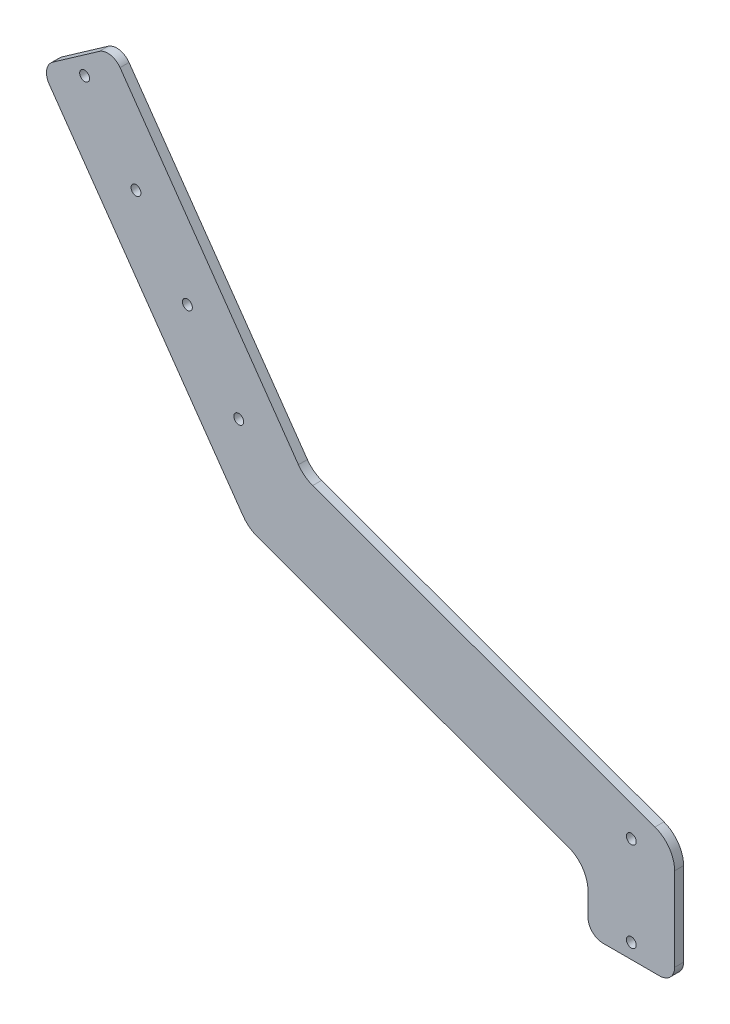
ISO-10303-21;
HEADER;
FILE_DESCRIPTION(('STEP AP214'),'2;1');
FILE_NAME('part.step','',(''),(''),'','','');
FILE_SCHEMA(('AUTOMOTIVE_DESIGN { 1 0 10303 214 1 1 1 1 }'));
ENDSEC;
DATA;
#1=APPLICATION_CONTEXT('core data for automotive mechanical design processes');
#2=APPLICATION_PROTOCOL_DEFINITION('international standard','automotive_design',2000,#1);
#3=PRODUCT_CONTEXT('',#1,'mechanical');
#4=PRODUCT('Part','Part','',(#3));
#5=PRODUCT_RELATED_PRODUCT_CATEGORY('part','',(#4));
#6=PRODUCT_DEFINITION_FORMATION('','',#4);
#7=PRODUCT_DEFINITION_CONTEXT('part definition',#1,'design');
#8=PRODUCT_DEFINITION('design','',#6,#7);
#9=PRODUCT_DEFINITION_SHAPE('','',#8);
#10=(LENGTH_UNIT() NAMED_UNIT(*) SI_UNIT(.MILLI.,.METRE.));
#11=(NAMED_UNIT(*) PLANE_ANGLE_UNIT() SI_UNIT($,.RADIAN.));
#12=(NAMED_UNIT(*) SI_UNIT($,.STERADIAN.) SOLID_ANGLE_UNIT());
#13=UNCERTAINTY_MEASURE_WITH_UNIT(LENGTH_MEASURE(1.E-05),#10,'distance_accuracy_value','');
#14=(GEOMETRIC_REPRESENTATION_CONTEXT(3) GLOBAL_UNCERTAINTY_ASSIGNED_CONTEXT((#13)) GLOBAL_UNIT_ASSIGNED_CONTEXT((#10,
#11,#12)) REPRESENTATION_CONTEXT('',''));
#15=CARTESIAN_POINT('',(0.,0.,0.));
#16=DIRECTION('',(0.,0.,1.));
#17=DIRECTION('',(1.,0.,0.));
#18=AXIS2_PLACEMENT_3D('',#15,#16,#17);
#19=CARTESIAN_POINT('',(0.,0.,3.));
#20=DIRECTION('',(0.,0.,1.));
#21=DIRECTION('',(1.,0.,0.));
#22=AXIS2_PLACEMENT_3D('',#19,#20,#21);
#23=PLANE('',#22);
#24=CARTESIAN_POINT('',(-148.638066054387,110.585525979013,3.));
#25=DIRECTION('',(0.,0.,1.));
#26=DIRECTION('',(1.,0.,0.));
#27=AXIS2_PLACEMENT_3D('',#24,#25,#26);
#28=CIRCLE('',#27,1.65000000000002);
#29=CARTESIAN_POINT('',(-146.988066054387,110.585525979013,3.));
#30=VERTEX_POINT('',#29);
#31=EDGE_CURVE('E324',#30,#30,#28,.T.);
#32=ORIENTED_EDGE('',*,*,#31,.F.);
#33=EDGE_LOOP('',(#32));
#34=FACE_BOUND('',#33,.T.);
#35=CARTESIAN_POINT('',(-183.05265223545,159.734648636353,3.));
#36=DIRECTION('',(0.,0.,1.));
#37=DIRECTION('',(1.,0.,0.));
#38=AXIS2_PLACEMENT_3D('',#35,#36,#37);
#39=CIRCLE('',#38,1.65000000000002);
#40=CARTESIAN_POINT('',(-181.40265223545,159.734648636353,3.));
#41=VERTEX_POINT('',#40);
#42=EDGE_CURVE('E312',#41,#41,#39,.T.);
#43=ORIENTED_EDGE('',*,*,#42,.F.);
#44=EDGE_LOOP('',(#43));
#45=FACE_BOUND('',#44,.T.);
#46=CARTESIAN_POINT('',(0.,0.,3.));
#47=DIRECTION('',(0.,0.,1.));
#48=DIRECTION('',(1.,0.,0.));
#49=AXIS2_PLACEMENT_3D('',#46,#47,#48);
#50=CIRCLE('',#49,1.65);
#51=CARTESIAN_POINT('',(1.65,0.,3.));
#52=VERTEX_POINT('',#51);
#53=EDGE_CURVE('E182',#52,#52,#50,.T.);
#54=ORIENTED_EDGE('',*,*,#53,.F.);
#55=EDGE_LOOP('',(#54));
#56=FACE_BOUND('',#55,.T.);
#57=DIRECTION('',(1.,0.,0.));
#58=VECTOR('',#57,1.);
#59=CARTESIAN_POINT('',(-14.5,-5.,3.));
#60=LINE('',#59,#58);
#61=CARTESIAN_POINT('',(-9.5,-5.,3.));
#62=VERTEX_POINT('',#61);
#63=CARTESIAN_POINT('',(9.49999999999999,-5.,3.));
#64=VERTEX_POINT('',#63);
#65=EDGE_CURVE('E303',#62,#64,#60,.T.);
#66=ORIENTED_EDGE('',*,*,#65,.T.);
#67=CARTESIAN_POINT('',(9.5,0.,3.));
#68=DIRECTION('',(0.,0.,1.));
#69=DIRECTION('',(1.,0.,0.));
#70=AXIS2_PLACEMENT_3D('',#67,#68,#69);
#71=CIRCLE('',#70,5.);
#72=CARTESIAN_POINT('',(14.5,0.,3.));
#73=VERTEX_POINT('',#72);
#74=EDGE_CURVE('E258',#64,#73,#71,.T.);
#75=ORIENTED_EDGE('',*,*,#74,.T.);
#76=DIRECTION('',(0.,1.,0.));
#77=VECTOR('',#76,1.);
#78=CARTESIAN_POINT('',(14.5,-5.,3.));
#79=LINE('',#78,#77);
#80=CARTESIAN_POINT('',(14.5,27.9979246179029,3.));
#81=VERTEX_POINT('',#80);
#82=EDGE_CURVE('E301',#73,#81,#79,.T.);
#83=ORIENTED_EDGE('',*,*,#82,.T.);
#84=CARTESIAN_POINT('',(4.5,27.9979246179029,3.));
#85=DIRECTION('',(0.,0.,1.));
#86=DIRECTION('',(1.,0.,0.));
#87=AXIS2_PLACEMENT_3D('',#84,#85,#86);
#88=CIRCLE('',#87,10.);
#89=CARTESIAN_POINT('',(7.92020143325664,37.394850825762,3.));
#90=VERTEX_POINT('',#89);
#91=EDGE_CURVE('E229',#81,#90,#88,.T.);
#92=ORIENTED_EDGE('',*,*,#91,.T.);
#93=DIRECTION('',(-0.939692620785909,0.342020143325666,0.));
#94=VECTOR('',#93,1.);
#95=CARTESIAN_POINT('',(-109.652000503099,80.1876327077301,3.));
#96=LINE('',#95,#94);
#97=CARTESIAN_POINT('',(-106.689161050576,79.1092473381022,3.));
#98=VERTEX_POINT('',#97);
#99=EDGE_CURVE('E281',#90,#98,#96,.T.);
#100=ORIENTED_EDGE('',*,*,#99,.T.);
#101=CARTESIAN_POINT('',(-103.268959617319,88.5061735459612,3.));
#102=DIRECTION('',(0.,0.,1.));
#103=DIRECTION('',(1.,0.,0.));
#104=AXIS2_PLACEMENT_3D('',#101,#102,#103);
#105=CIRCLE('',#104,10.);
#106=CARTESIAN_POINT('',(-111.460480060209,82.7704091824507,3.));
#107=VERTEX_POINT('',#106);
#108=EDGE_CURVE('E236',#98,#107,#105,.F.);
#109=ORIENTED_EDGE('',*,*,#108,.T.);
#110=DIRECTION('',(-0.57357643635105,0.819152044288989,0.));
#111=VECTOR('',#110,1.);
#112=CARTESIAN_POINT('',(-174.042829775015,172.147267184888,3.));
#113=LINE('',#112,#111);
#114=CARTESIAN_POINT('',(-171.17494759326,168.051506963443,3.));
#115=VERTEX_POINT('',#114);
#116=EDGE_CURVE('E270',#107,#115,#113,.T.);
#117=ORIENTED_EDGE('',*,*,#116,.T.);
#118=CARTESIAN_POINT('',(-175.270707814705,165.183624781688,3.));
#119=DIRECTION('',(0.,0.,1.));
#120=DIRECTION('',(1.,0.,0.));
#121=AXIS2_PLACEMENT_3D('',#118,#119,#120);
#122=CIRCLE('',#121,5.);
#123=CARTESIAN_POINT('',(-178.13858999646,169.279385003133,3.));
#124=VERTEX_POINT('',#123);
#125=EDGE_CURVE('E254',#115,#124,#122,.T.);
#126=ORIENTED_EDGE('',*,*,#125,.T.);
#127=DIRECTION('',(-0.819152044288989,-0.57357643635105,0.));
#128=VECTOR('',#127,1.);
#129=CARTESIAN_POINT('',(-174.042829775015,172.147267184888,3.));
#130=LINE('',#129,#128);
#131=CARTESIAN_POINT('',(-193.702478837951,158.381432712463,3.));
#132=VERTEX_POINT('',#131);
#133=EDGE_CURVE('E280',#124,#132,#130,.T.);
#134=ORIENTED_EDGE('',*,*,#133,.T.);
#135=CARTESIAN_POINT('',(-190.834596656196,154.285672491018,3.));
#136=DIRECTION('',(0.,0.,1.));
#137=DIRECTION('',(1.,0.,0.));
#138=AXIS2_PLACEMENT_3D('',#135,#136,#137);
#139=CIRCLE('',#138,5.);
#140=CARTESIAN_POINT('',(-194.930356877641,151.417790309263,3.));
#141=VERTEX_POINT('',#140);
#142=EDGE_CURVE('E64',#132,#141,#139,.T.);
#143=ORIENTED_EDGE('',*,*,#142,.T.);
#144=DIRECTION('',(0.57357643635105,-0.819152044288989,0.));
#145=VECTOR('',#144,1.);
#146=CARTESIAN_POINT('',(-197.798239059396,155.513550530708,3.));
#147=LINE('',#146,#145);
#148=CARTESIAN_POINT('',(-129.971298628971,58.6466407515806,3.));
#149=VERTEX_POINT('',#148);
#150=EDGE_CURVE('E294',#141,#149,#147,.T.);
#151=ORIENTED_EDGE('',*,*,#150,.T.);
#152=CARTESIAN_POINT('',(-121.779778186081,64.3824051150911,3.));
#153=DIRECTION('',(0.,0.,1.));
#154=DIRECTION('',(1.,0.,0.));
#155=AXIS2_PLACEMENT_3D('',#152,#153,#154);
#156=CIRCLE('',#155,10.);
#157=CARTESIAN_POINT('',(-125.199979619337,54.985478907232,3.));
#158=VERTEX_POINT('',#157);
#159=EDGE_CURVE('E227',#149,#158,#156,.T.);
#160=ORIENTED_EDGE('',*,*,#159,.T.);
#161=DIRECTION('',(0.93969262078591,-0.342020143325665,0.));
#162=VECTOR('',#161,1.);
#163=CARTESIAN_POINT('',(-128.16281907186,56.06386427686,3.));
#164=LINE('',#163,#162);
#165=CARTESIAN_POINT('',(-21.0797985667433,17.0888322176803,3.));
#166=VERTEX_POINT('',#165);
#167=EDGE_CURVE('E174',#158,#166,#164,.T.);
#168=ORIENTED_EDGE('',*,*,#167,.T.);
#169=CARTESIAN_POINT('',(-24.5,7.69190600982124,3.));
#170=DIRECTION('',(0.,0.,1.));
#171=DIRECTION('',(1.,0.,0.));
#172=AXIS2_PLACEMENT_3D('',#169,#170,#171);
#173=CIRCLE('',#172,10.);
#174=CARTESIAN_POINT('',(-14.5,7.69190600982124,3.));
#175=VERTEX_POINT('',#174);
#176=EDGE_CURVE('E167',#166,#175,#173,.F.);
#177=ORIENTED_EDGE('',*,*,#176,.T.);
#178=DIRECTION('',(0.,-1.,0.));
#179=VECTOR('',#178,1.);
#180=CARTESIAN_POINT('',(-14.5,14.6939813919184,3.));
#181=LINE('',#180,#179);
#182=CARTESIAN_POINT('',(-14.5,0.,3.));
#183=VERTEX_POINT('',#182);
#184=EDGE_CURVE('E172',#175,#183,#181,.T.);
#185=ORIENTED_EDGE('',*,*,#184,.T.);
#186=CARTESIAN_POINT('',(-9.5,0.,3.));
#187=DIRECTION('',(0.,0.,1.));
#188=DIRECTION('',(1.,0.,0.));
#189=AXIS2_PLACEMENT_3D('',#186,#187,#188);
#190=CIRCLE('',#189,5.);
#191=EDGE_CURVE('E256',#183,#62,#190,.T.);
#192=ORIENTED_EDGE('',*,*,#191,.T.);
#193=EDGE_LOOP('',(#66,#75,#83,#92,#100,#109,#117,#126,#134,#143,#151,#160,#168,#177,#185,#192));
#194=FACE_BOUND('',#193,.T.);
#195=CARTESIAN_POINT('',(0.,30.,3.));
#196=DIRECTION('',(0.,0.,1.));
#197=DIRECTION('',(1.,0.,0.));
#198=AXIS2_PLACEMENT_3D('',#195,#196,#197);
#199=CIRCLE('',#198,1.65);
#200=CARTESIAN_POINT('',(1.65,30.,3.));
#201=VERTEX_POINT('',#200);
#202=EDGE_CURVE('E307',#201,#201,#199,.T.);
#203=ORIENTED_EDGE('',*,*,#202,.F.);
#204=EDGE_LOOP('',(#203));
#205=FACE_BOUND('',#204,.T.);
#206=CARTESIAN_POINT('',(-165.845359144919,135.160087307683,3.));
#207=DIRECTION('',(0.,0.,1.));
#208=DIRECTION('',(1.,0.,0.));
#209=AXIS2_PLACEMENT_3D('',#206,#207,#208);
#210=CIRCLE('',#209,1.65000000000002);
#211=CARTESIAN_POINT('',(-164.195359144919,135.160087307683,3.));
#212=VERTEX_POINT('',#211);
#213=EDGE_CURVE('E318',#212,#212,#210,.T.);
#214=ORIENTED_EDGE('',*,*,#213,.F.);
#215=EDGE_LOOP('',(#214));
#216=FACE_BOUND('',#215,.T.);
#217=CARTESIAN_POINT('',(-131.430772963856,86.0109646503438,3.));
#218=DIRECTION('',(0.,0.,1.));
#219=DIRECTION('',(1.,0.,0.));
#220=AXIS2_PLACEMENT_3D('',#217,#218,#219);
#221=CIRCLE('',#220,1.65000000000002);
#222=CARTESIAN_POINT('',(-129.780772963856,86.0109646503438,3.));
#223=VERTEX_POINT('',#222);
#224=EDGE_CURVE('E330',#223,#223,#221,.T.);
#225=ORIENTED_EDGE('',*,*,#224,.F.);
#226=EDGE_LOOP('',(#225));
#227=FACE_BOUND('',#226,.T.);
#228=ADVANCED_FACE('F41',(#34,#45,#56,#194,#205,#216,#227),#23,.T.);
#229=CARTESIAN_POINT('',(0.,0.,0.));
#230=DIRECTION('',(0.,0.,1.));
#231=DIRECTION('',(1.,0.,0.));
#232=AXIS2_PLACEMENT_3D('',#229,#230,#231);
#233=PLANE('',#232);
#234=DIRECTION('',(0.,1.,0.));
#235=VECTOR('',#234,1.);
#236=CARTESIAN_POINT('',(14.5,-5.,0.));
#237=LINE('',#236,#235);
#238=CARTESIAN_POINT('',(14.5,0.,0.));
#239=VERTEX_POINT('',#238);
#240=CARTESIAN_POINT('',(14.5,27.9979246179029,0.));
#241=VERTEX_POINT('',#240);
#242=EDGE_CURVE('E185',#239,#241,#237,.T.);
#243=ORIENTED_EDGE('',*,*,#242,.F.);
#244=CARTESIAN_POINT('',(9.5,0.,0.));
#245=DIRECTION('',(0.,0.,1.));
#246=DIRECTION('',(1.,0.,0.));
#247=AXIS2_PLACEMENT_3D('',#244,#245,#246);
#248=CIRCLE('',#247,5.);
#249=CARTESIAN_POINT('',(9.49999999999999,-5.,0.));
#250=VERTEX_POINT('',#249);
#251=EDGE_CURVE('E246',#239,#250,#248,.F.);
#252=ORIENTED_EDGE('',*,*,#251,.T.);
#253=DIRECTION('',(1.,0.,0.));
#254=VECTOR('',#253,1.);
#255=CARTESIAN_POINT('',(-14.5,-5.,0.));
#256=LINE('',#255,#254);
#257=CARTESIAN_POINT('',(-9.5,-5.,0.));
#258=VERTEX_POINT('',#257);
#259=EDGE_CURVE('E181',#258,#250,#256,.T.);
#260=ORIENTED_EDGE('',*,*,#259,.F.);
#261=CARTESIAN_POINT('',(-9.5,0.,0.));
#262=DIRECTION('',(0.,0.,1.));
#263=DIRECTION('',(1.,0.,0.));
#264=AXIS2_PLACEMENT_3D('',#261,#262,#263);
#265=CIRCLE('',#264,5.);
#266=CARTESIAN_POINT('',(-14.5,0.,0.));
#267=VERTEX_POINT('',#266);
#268=EDGE_CURVE('E180',#258,#267,#265,.F.);
#269=ORIENTED_EDGE('',*,*,#268,.T.);
#270=DIRECTION('',(0.,-1.,0.));
#271=VECTOR('',#270,1.);
#272=CARTESIAN_POINT('',(-14.5,14.6939813919184,0.));
#273=LINE('',#272,#271);
#274=CARTESIAN_POINT('',(-14.5,7.69190600982124,0.));
#275=VERTEX_POINT('',#274);
#276=EDGE_CURVE('E171',#275,#267,#273,.T.);
#277=ORIENTED_EDGE('',*,*,#276,.F.);
#278=CARTESIAN_POINT('',(-24.5,7.69190600982124,0.));
#279=DIRECTION('',(0.,0.,1.));
#280=DIRECTION('',(1.,0.,0.));
#281=AXIS2_PLACEMENT_3D('',#278,#279,#280);
#282=CIRCLE('',#281,10.);
#283=CARTESIAN_POINT('',(-21.0797985667433,17.0888322176803,0.));
#284=VERTEX_POINT('',#283);
#285=EDGE_CURVE('E157',#275,#284,#282,.T.);
#286=ORIENTED_EDGE('',*,*,#285,.T.);
#287=DIRECTION('',(0.93969262078591,-0.342020143325665,0.));
#288=VECTOR('',#287,1.);
#289=CARTESIAN_POINT('',(-128.16281907186,56.06386427686,0.));
#290=LINE('',#289,#288);
#291=CARTESIAN_POINT('',(-125.199979619337,54.985478907232,0.));
#292=VERTEX_POINT('',#291);
#293=EDGE_CURVE('E205',#292,#284,#290,.T.);
#294=ORIENTED_EDGE('',*,*,#293,.F.);
#295=CARTESIAN_POINT('',(-121.779778186081,64.3824051150911,0.));
#296=DIRECTION('',(0.,0.,1.));
#297=DIRECTION('',(1.,0.,0.));
#298=AXIS2_PLACEMENT_3D('',#295,#296,#297);
#299=CIRCLE('',#298,10.);
#300=CARTESIAN_POINT('',(-129.971298628971,58.6466407515806,0.));
#301=VERTEX_POINT('',#300);
#302=EDGE_CURVE('E218',#292,#301,#299,.F.);
#303=ORIENTED_EDGE('',*,*,#302,.T.);
#304=DIRECTION('',(0.57357643635105,-0.819152044288989,0.));
#305=VECTOR('',#304,1.);
#306=CARTESIAN_POINT('',(-197.798239059396,155.513550530708,0.));
#307=LINE('',#306,#305);
#308=CARTESIAN_POINT('',(-194.930356877641,151.417790309263,0.));
#309=VERTEX_POINT('',#308);
#310=EDGE_CURVE('E203',#309,#301,#307,.T.);
#311=ORIENTED_EDGE('',*,*,#310,.F.);
#312=CARTESIAN_POINT('',(-190.834596656196,154.285672491018,0.));
#313=DIRECTION('',(0.,0.,1.));
#314=DIRECTION('',(1.,0.,0.));
#315=AXIS2_PLACEMENT_3D('',#312,#313,#314);
#316=CIRCLE('',#315,5.);
#317=CARTESIAN_POINT('',(-193.702478837951,158.381432712463,0.));
#318=VERTEX_POINT('',#317);
#319=EDGE_CURVE('E241',#309,#318,#316,.F.);
#320=ORIENTED_EDGE('',*,*,#319,.T.);
#321=DIRECTION('',(-0.819152044288989,-0.57357643635105,0.));
#322=VECTOR('',#321,1.);
#323=CARTESIAN_POINT('',(-174.042829775015,172.147267184888,0.));
#324=LINE('',#323,#322);
#325=CARTESIAN_POINT('',(-178.13858999646,169.279385003133,0.));
#326=VERTEX_POINT('',#325);
#327=EDGE_CURVE('E200',#326,#318,#324,.T.);
#328=ORIENTED_EDGE('',*,*,#327,.F.);
#329=CARTESIAN_POINT('',(-175.270707814705,165.183624781688,0.));
#330=DIRECTION('',(0.,0.,1.));
#331=DIRECTION('',(1.,0.,0.));
#332=AXIS2_PLACEMENT_3D('',#329,#330,#331);
#333=CIRCLE('',#332,5.);
#334=CARTESIAN_POINT('',(-171.17494759326,168.051506963443,0.));
#335=VERTEX_POINT('',#334);
#336=EDGE_CURVE('E243',#326,#335,#333,.F.);
#337=ORIENTED_EDGE('',*,*,#336,.T.);
#338=DIRECTION('',(-0.57357643635105,0.819152044288989,0.));
#339=VECTOR('',#338,1.);
#340=CARTESIAN_POINT('',(-174.042829775015,172.147267184888,0.));
#341=LINE('',#340,#339);
#342=CARTESIAN_POINT('',(-111.460480060209,82.7704091824507,0.));
#343=VERTEX_POINT('',#342);
#344=EDGE_CURVE('E197',#343,#335,#341,.T.);
#345=ORIENTED_EDGE('',*,*,#344,.F.);
#346=CARTESIAN_POINT('',(-103.268959617319,88.5061735459612,0.));
#347=DIRECTION('',(0.,0.,1.));
#348=DIRECTION('',(1.,0.,0.));
#349=AXIS2_PLACEMENT_3D('',#346,#347,#348);
#350=CIRCLE('',#349,10.);
#351=CARTESIAN_POINT('',(-106.689161050576,79.1092473381022,0.));
#352=VERTEX_POINT('',#351);
#353=EDGE_CURVE('E234',#343,#352,#350,.T.);
#354=ORIENTED_EDGE('',*,*,#353,.T.);
#355=DIRECTION('',(-0.939692620785909,0.342020143325666,0.));
#356=VECTOR('',#355,1.);
#357=CARTESIAN_POINT('',(-109.652000503099,80.1876327077301,0.));
#358=LINE('',#357,#356);
#359=CARTESIAN_POINT('',(7.92020143325664,37.394850825762,0.));
#360=VERTEX_POINT('',#359);
#361=EDGE_CURVE('E194',#360,#352,#358,.T.);
#362=ORIENTED_EDGE('',*,*,#361,.F.);
#363=CARTESIAN_POINT('',(4.5,27.9979246179029,0.));
#364=DIRECTION('',(0.,0.,1.));
#365=DIRECTION('',(1.,0.,0.));
#366=AXIS2_PLACEMENT_3D('',#363,#364,#365);
#367=CIRCLE('',#366,10.);
#368=EDGE_CURVE('E221',#360,#241,#367,.F.);
#369=ORIENTED_EDGE('',*,*,#368,.T.);
#370=EDGE_LOOP('',(#243,#252,#260,#269,#277,#286,#294,#303,#311,#320,#328,#337,#345,#354,#362,#369));
#371=FACE_BOUND('',#370,.T.);
#372=CARTESIAN_POINT('',(0.,0.,0.));
#373=DIRECTION('',(0.,0.,1.));
#374=DIRECTION('',(1.,0.,0.));
#375=AXIS2_PLACEMENT_3D('',#372,#373,#374);
#376=CIRCLE('',#375,1.65);
#377=CARTESIAN_POINT('',(1.65,0.,0.));
#378=VERTEX_POINT('',#377);
#379=EDGE_CURVE('E188',#378,#378,#376,.T.);
#380=ORIENTED_EDGE('',*,*,#379,.T.);
#381=EDGE_LOOP('',(#380));
#382=FACE_BOUND('',#381,.T.);
#383=CARTESIAN_POINT('',(0.,30.,0.));
#384=DIRECTION('',(0.,0.,1.));
#385=DIRECTION('',(1.,0.,0.));
#386=AXIS2_PLACEMENT_3D('',#383,#384,#385);
#387=CIRCLE('',#386,1.65);
#388=CARTESIAN_POINT('',(1.65,30.,0.));
#389=VERTEX_POINT('',#388);
#390=EDGE_CURVE('E309',#389,#389,#387,.T.);
#391=ORIENTED_EDGE('',*,*,#390,.T.);
#392=EDGE_LOOP('',(#391));
#393=FACE_BOUND('',#392,.T.);
#394=CARTESIAN_POINT('',(-183.05265223545,159.734648636353,0.));
#395=DIRECTION('',(0.,0.,1.));
#396=DIRECTION('',(1.,0.,0.));
#397=AXIS2_PLACEMENT_3D('',#394,#395,#396);
#398=CIRCLE('',#397,1.65000000000002);
#399=CARTESIAN_POINT('',(-181.40265223545,159.734648636353,0.));
#400=VERTEX_POINT('',#399);
#401=EDGE_CURVE('E315',#400,#400,#398,.T.);
#402=ORIENTED_EDGE('',*,*,#401,.T.);
#403=EDGE_LOOP('',(#402));
#404=FACE_BOUND('',#403,.T.);
#405=CARTESIAN_POINT('',(-165.845359144919,135.160087307683,0.));
#406=DIRECTION('',(0.,0.,1.));
#407=DIRECTION('',(1.,0.,0.));
#408=AXIS2_PLACEMENT_3D('',#405,#406,#407);
#409=CIRCLE('',#408,1.65000000000002);
#410=CARTESIAN_POINT('',(-164.195359144919,135.160087307683,0.));
#411=VERTEX_POINT('',#410);
#412=EDGE_CURVE('E321',#411,#411,#409,.T.);
#413=ORIENTED_EDGE('',*,*,#412,.T.);
#414=EDGE_LOOP('',(#413));
#415=FACE_BOUND('',#414,.T.);
#416=CARTESIAN_POINT('',(-148.638066054387,110.585525979013,0.));
#417=DIRECTION('',(0.,0.,1.));
#418=DIRECTION('',(1.,0.,0.));
#419=AXIS2_PLACEMENT_3D('',#416,#417,#418);
#420=CIRCLE('',#419,1.65000000000002);
#421=CARTESIAN_POINT('',(-146.988066054387,110.585525979013,0.));
#422=VERTEX_POINT('',#421);
#423=EDGE_CURVE('E327',#422,#422,#420,.T.);
#424=ORIENTED_EDGE('',*,*,#423,.T.);
#425=EDGE_LOOP('',(#424));
#426=FACE_BOUND('',#425,.T.);
#427=CARTESIAN_POINT('',(-131.430772963856,86.0109646503438,0.));
#428=DIRECTION('',(0.,0.,1.));
#429=DIRECTION('',(1.,0.,0.));
#430=AXIS2_PLACEMENT_3D('',#427,#428,#429);
#431=CIRCLE('',#430,1.65000000000002);
#432=CARTESIAN_POINT('',(-129.780772963856,86.0109646503438,0.));
#433=VERTEX_POINT('',#432);
#434=EDGE_CURVE('E333',#433,#433,#431,.T.);
#435=ORIENTED_EDGE('',*,*,#434,.T.);
#436=EDGE_LOOP('',(#435));
#437=FACE_BOUND('',#436,.T.);
#438=ADVANCED_FACE('F177',(#371,#382,#393,#404,#415,#426,#437),#233,.F.);
#439=CARTESIAN_POINT('',(-14.5,14.6939813919184,3.));
#440=DIRECTION('',(1.,0.,0.));
#441=DIRECTION('',(0.,1.,0.));
#442=AXIS2_PLACEMENT_3D('',#439,#440,#441);
#443=PLANE('',#442);
#444=ORIENTED_EDGE('',*,*,#276,.T.);
#445=DIRECTION('',(0.,0.,-1.));
#446=VECTOR('',#445,1.);
#447=CARTESIAN_POINT('',(-14.5,0.,3.));
#448=LINE('',#447,#446);
#449=EDGE_CURVE('E56',#267,#183,#448,.F.);
#450=ORIENTED_EDGE('',*,*,#449,.T.);
#451=ORIENTED_EDGE('',*,*,#184,.F.);
#452=DIRECTION('',(0.,0.,-1.));
#453=VECTOR('',#452,1.);
#454=CARTESIAN_POINT('',(-14.5,7.69190600982124,0.));
#455=LINE('',#454,#453);
#456=EDGE_CURVE('E161',#175,#275,#455,.T.);
#457=ORIENTED_EDGE('',*,*,#456,.T.);
#458=EDGE_LOOP('',(#444,#450,#451,#457));
#459=FACE_BOUND('',#458,.T.);
#460=ADVANCED_FACE('F170',(#459),#443,.F.);
#461=CARTESIAN_POINT('',(-14.5,-5.,3.));
#462=DIRECTION('',(0.,1.,0.));
#463=DIRECTION('',(0.,0.,1.));
#464=AXIS2_PLACEMENT_3D('',#461,#462,#463);
#465=PLANE('',#464);
#466=ORIENTED_EDGE('',*,*,#259,.T.);
#467=DIRECTION('',(0.,0.,-1.));
#468=VECTOR('',#467,1.);
#469=CARTESIAN_POINT('',(9.5,-5.,3.));
#470=LINE('',#469,#468);
#471=EDGE_CURVE('E251',#250,#64,#470,.F.);
#472=ORIENTED_EDGE('',*,*,#471,.T.);
#473=ORIENTED_EDGE('',*,*,#65,.F.);
#474=DIRECTION('',(0.,0.,-1.));
#475=VECTOR('',#474,1.);
#476=CARTESIAN_POINT('',(-9.5,-5.,3.));
#477=LINE('',#476,#475);
#478=EDGE_CURVE('E248',#62,#258,#477,.T.);
#479=ORIENTED_EDGE('',*,*,#478,.T.);
#480=EDGE_LOOP('',(#466,#472,#473,#479));
#481=FACE_BOUND('',#480,.T.);
#482=ADVANCED_FACE('F373',(#481),#465,.F.);
#483=CARTESIAN_POINT('',(14.5,-5.,3.));
#484=DIRECTION('',(-1.,0.,0.));
#485=DIRECTION('',(0.,-1.,0.));
#486=AXIS2_PLACEMENT_3D('',#483,#484,#485);
#487=PLANE('',#486);
#488=ORIENTED_EDGE('',*,*,#82,.F.);
#489=DIRECTION('',(0.,0.,-1.));
#490=VECTOR('',#489,1.);
#491=CARTESIAN_POINT('',(14.5,0.,3.));
#492=LINE('',#491,#490);
#493=EDGE_CURVE('E238',#73,#239,#492,.T.);
#494=ORIENTED_EDGE('',*,*,#493,.T.);
#495=ORIENTED_EDGE('',*,*,#242,.T.);
#496=DIRECTION('',(0.,0.,-1.));
#497=VECTOR('',#496,1.);
#498=CARTESIAN_POINT('',(14.5,27.9979246179029,3.));
#499=LINE('',#498,#497);
#500=EDGE_CURVE('E224',#241,#81,#499,.F.);
#501=ORIENTED_EDGE('',*,*,#500,.T.);
#502=EDGE_LOOP('',(#488,#494,#495,#501));
#503=FACE_BOUND('',#502,.T.);
#504=ADVANCED_FACE('F369',(#503),#487,.F.);
#505=CARTESIAN_POINT('',(-109.652000503099,80.1876327077301,3.));
#506=DIRECTION('',(-0.342020143325666,-0.93969262078591,0.));
#507=DIRECTION('',(0.93969262078591,-0.342020143325666,0.));
#508=AXIS2_PLACEMENT_3D('',#505,#506,#507);
#509=PLANE('',#508);
#510=ORIENTED_EDGE('',*,*,#361,.T.);
#511=DIRECTION('',(0.,0.,-1.));
#512=VECTOR('',#511,1.);
#513=CARTESIAN_POINT('',(-106.689161050576,79.1092473381022,3.));
#514=LINE('',#513,#512);
#515=EDGE_CURVE('E216',#352,#98,#514,.F.);
#516=ORIENTED_EDGE('',*,*,#515,.T.);
#517=ORIENTED_EDGE('',*,*,#99,.F.);
#518=DIRECTION('',(0.,0.,-1.));
#519=VECTOR('',#518,1.);
#520=CARTESIAN_POINT('',(7.92020143325665,37.394850825762,3.));
#521=LINE('',#520,#519);
#522=EDGE_CURVE('E213',#90,#360,#521,.T.);
#523=ORIENTED_EDGE('',*,*,#522,.T.);
#524=EDGE_LOOP('',(#510,#516,#517,#523));
#525=FACE_BOUND('',#524,.T.);
#526=ADVANCED_FACE('F366',(#525),#509,.F.);
#527=CARTESIAN_POINT('',(-174.042829775015,172.147267184888,3.));
#528=DIRECTION('',(-0.819152044288989,-0.57357643635105,0.));
#529=DIRECTION('',(0.57357643635105,-0.819152044288989,0.));
#530=AXIS2_PLACEMENT_3D('',#527,#528,#529);
#531=PLANE('',#530);
#532=ORIENTED_EDGE('',*,*,#344,.T.);
#533=DIRECTION('',(0.,0.,-1.));
#534=VECTOR('',#533,1.);
#535=CARTESIAN_POINT('',(-171.17494759326,168.051506963443,3.));
#536=LINE('',#535,#534);
#537=EDGE_CURVE('E49',#335,#115,#536,.F.);
#538=ORIENTED_EDGE('',*,*,#537,.T.);
#539=ORIENTED_EDGE('',*,*,#116,.F.);
#540=DIRECTION('',(0.,0.,-1.));
#541=VECTOR('',#540,1.);
#542=CARTESIAN_POINT('',(-111.460480060209,82.7704091824507,0.));
#543=LINE('',#542,#541);
#544=EDGE_CURVE('E210',#107,#343,#543,.T.);
#545=ORIENTED_EDGE('',*,*,#544,.T.);
#546=EDGE_LOOP('',(#532,#538,#539,#545));
#547=FACE_BOUND('',#546,.T.);
#548=ADVANCED_FACE('F269',(#547),#531,.F.);
#549=CARTESIAN_POINT('',(-174.042829775015,172.147267184888,3.));
#550=DIRECTION('',(0.57357643635105,-0.819152044288989,0.));
#551=DIRECTION('',(0.819152044288989,0.57357643635105,0.));
#552=AXIS2_PLACEMENT_3D('',#549,#550,#551);
#553=PLANE('',#552);
#554=ORIENTED_EDGE('',*,*,#133,.F.);
#555=DIRECTION('',(0.,0.,-1.));
#556=VECTOR('',#555,1.);
#557=CARTESIAN_POINT('',(-178.13858999646,169.279385003133,3.));
#558=LINE('',#557,#556);
#559=EDGE_CURVE('E263',#124,#326,#558,.T.);
#560=ORIENTED_EDGE('',*,*,#559,.T.);
#561=ORIENTED_EDGE('',*,*,#327,.T.);
#562=DIRECTION('',(0.,0.,-1.));
#563=VECTOR('',#562,1.);
#564=CARTESIAN_POINT('',(-193.702478837951,158.381432712463,3.));
#565=LINE('',#564,#563);
#566=EDGE_CURVE('E261',#318,#132,#565,.F.);
#567=ORIENTED_EDGE('',*,*,#566,.T.);
#568=EDGE_LOOP('',(#554,#560,#561,#567));
#569=FACE_BOUND('',#568,.T.);
#570=ADVANCED_FACE('F287',(#569),#553,.F.);
#571=CARTESIAN_POINT('',(-197.798239059396,155.513550530708,3.));
#572=DIRECTION('',(0.819152044288989,0.57357643635105,0.));
#573=DIRECTION('',(-0.57357643635105,0.819152044288989,0.));
#574=AXIS2_PLACEMENT_3D('',#571,#572,#573);
#575=PLANE('',#574);
#576=ORIENTED_EDGE('',*,*,#150,.F.);
#577=DIRECTION('',(0.,0.,-1.));
#578=VECTOR('',#577,1.);
#579=CARTESIAN_POINT('',(-194.930356877641,151.417790309263,3.));
#580=LINE('',#579,#578);
#581=EDGE_CURVE('E11',#141,#309,#580,.T.);
#582=ORIENTED_EDGE('',*,*,#581,.T.);
#583=ORIENTED_EDGE('',*,*,#310,.T.);
#584=DIRECTION('',(0.,0.,-1.));
#585=VECTOR('',#584,1.);
#586=CARTESIAN_POINT('',(-129.971298628971,58.6466407515806,3.));
#587=LINE('',#586,#585);
#588=EDGE_CURVE('E168',#301,#149,#587,.F.);
#589=ORIENTED_EDGE('',*,*,#588,.T.);
#590=EDGE_LOOP('',(#576,#582,#583,#589));
#591=FACE_BOUND('',#590,.T.);
#592=ADVANCED_FACE('F293',(#591),#575,.F.);
#593=CARTESIAN_POINT('',(-128.16281907186,56.06386427686,3.));
#594=DIRECTION('',(0.342020143325665,0.93969262078591,0.));
#595=DIRECTION('',(-0.93969262078591,0.342020143325665,0.));
#596=AXIS2_PLACEMENT_3D('',#593,#594,#595);
#597=PLANE('',#596);
#598=ORIENTED_EDGE('',*,*,#293,.T.);
#599=DIRECTION('',(0.,0.,-1.));
#600=VECTOR('',#599,1.);
#601=CARTESIAN_POINT('',(-21.0797985667433,17.0888322176803,3.));
#602=LINE('',#601,#600);
#603=EDGE_CURVE('E162',#284,#166,#602,.F.);
#604=ORIENTED_EDGE('',*,*,#603,.T.);
#605=ORIENTED_EDGE('',*,*,#167,.F.);
#606=DIRECTION('',(0.,0.,-1.));
#607=VECTOR('',#606,1.);
#608=CARTESIAN_POINT('',(-125.199979619337,54.985478907232,3.));
#609=LINE('',#608,#607);
#610=EDGE_CURVE('E173',#158,#292,#609,.T.);
#611=ORIENTED_EDGE('',*,*,#610,.T.);
#612=EDGE_LOOP('',(#598,#604,#605,#611));
#613=FACE_BOUND('',#612,.T.);
#614=ADVANCED_FACE('F356',(#613),#597,.F.);
#615=CARTESIAN_POINT('',(0.,0.,3.));
#616=DIRECTION('',(0.,0.,-1.));
#617=DIRECTION('',(-1.,0.,0.));
#618=AXIS2_PLACEMENT_3D('',#615,#616,#617);
#619=CYLINDRICAL_SURFACE('',#618,1.65);
#620=ORIENTED_EDGE('',*,*,#53,.T.);
#621=EDGE_LOOP('',(#620));
#622=FACE_BOUND('',#621,.T.);
#623=ORIENTED_EDGE('',*,*,#379,.F.);
#624=EDGE_LOOP('',(#623));
#625=FACE_BOUND('',#624,.T.);
#626=ADVANCED_FACE('F353',(#622,#625),#619,.F.);
#627=CARTESIAN_POINT('',(0.,30.,3.));
#628=DIRECTION('',(0.,0.,-1.));
#629=DIRECTION('',(-1.,0.,0.));
#630=AXIS2_PLACEMENT_3D('',#627,#628,#629);
#631=CYLINDRICAL_SURFACE('',#630,1.65);
#632=ORIENTED_EDGE('',*,*,#202,.T.);
#633=EDGE_LOOP('',(#632));
#634=FACE_BOUND('',#633,.T.);
#635=ORIENTED_EDGE('',*,*,#390,.F.);
#636=EDGE_LOOP('',(#635));
#637=FACE_BOUND('',#636,.T.);
#638=ADVANCED_FACE('F485',(#634,#637),#631,.F.);
#639=CARTESIAN_POINT('',(-183.05265223545,159.734648636353,3.));
#640=DIRECTION('',(0.,0.,-1.));
#641=DIRECTION('',(-1.,0.,0.));
#642=AXIS2_PLACEMENT_3D('',#639,#640,#641);
#643=CYLINDRICAL_SURFACE('',#642,1.65000000000002);
#644=ORIENTED_EDGE('',*,*,#42,.T.);
#645=EDGE_LOOP('',(#644));
#646=FACE_BOUND('',#645,.T.);
#647=ORIENTED_EDGE('',*,*,#401,.F.);
#648=EDGE_LOOP('',(#647));
#649=FACE_BOUND('',#648,.T.);
#650=ADVANCED_FACE('F475',(#646,#649),#643,.F.);
#651=CARTESIAN_POINT('',(-165.845359144919,135.160087307683,3.));
#652=DIRECTION('',(0.,0.,-1.));
#653=DIRECTION('',(-1.,0.,0.));
#654=AXIS2_PLACEMENT_3D('',#651,#652,#653);
#655=CYLINDRICAL_SURFACE('',#654,1.65000000000002);
#656=ORIENTED_EDGE('',*,*,#213,.T.);
#657=EDGE_LOOP('',(#656));
#658=FACE_BOUND('',#657,.T.);
#659=ORIENTED_EDGE('',*,*,#412,.F.);
#660=EDGE_LOOP('',(#659));
#661=FACE_BOUND('',#660,.T.);
#662=ADVANCED_FACE('F465',(#658,#661),#655,.F.);
#663=CARTESIAN_POINT('',(-148.638066054387,110.585525979013,3.));
#664=DIRECTION('',(0.,0.,-1.));
#665=DIRECTION('',(-1.,0.,0.));
#666=AXIS2_PLACEMENT_3D('',#663,#664,#665);
#667=CYLINDRICAL_SURFACE('',#666,1.65000000000002);
#668=ORIENTED_EDGE('',*,*,#31,.T.);
#669=EDGE_LOOP('',(#668));
#670=FACE_BOUND('',#669,.T.);
#671=ORIENTED_EDGE('',*,*,#423,.F.);
#672=EDGE_LOOP('',(#671));
#673=FACE_BOUND('',#672,.T.);
#674=ADVANCED_FACE('F456',(#670,#673),#667,.F.);
#675=CARTESIAN_POINT('',(-131.430772963856,86.0109646503438,3.));
#676=DIRECTION('',(0.,0.,-1.));
#677=DIRECTION('',(-1.,0.,0.));
#678=AXIS2_PLACEMENT_3D('',#675,#676,#677);
#679=CYLINDRICAL_SURFACE('',#678,1.65000000000002);
#680=ORIENTED_EDGE('',*,*,#224,.T.);
#681=EDGE_LOOP('',(#680));
#682=FACE_BOUND('',#681,.T.);
#683=ORIENTED_EDGE('',*,*,#434,.F.);
#684=EDGE_LOOP('',(#683));
#685=FACE_BOUND('',#684,.T.);
#686=ADVANCED_FACE('F339',(#682,#685),#679,.F.);
#687=CARTESIAN_POINT('',(-24.5,7.69190600982124,3.));
#688=DIRECTION('',(0.,0.,1.));
#689=DIRECTION('',(1.,0.,0.));
#690=AXIS2_PLACEMENT_3D('',#687,#688,#689);
#691=CYLINDRICAL_SURFACE('',#690,10.);
#692=ORIENTED_EDGE('',*,*,#176,.F.);
#693=ORIENTED_EDGE('',*,*,#603,.F.);
#694=ORIENTED_EDGE('',*,*,#285,.F.);
#695=ORIENTED_EDGE('',*,*,#456,.F.);
#696=EDGE_LOOP('',(#692,#693,#694,#695));
#697=FACE_BOUND('',#696,.T.);
#698=ADVANCED_FACE('F160',(#697),#691,.F.);
#699=CARTESIAN_POINT('',(-103.268959617319,88.5061735459612,3.));
#700=DIRECTION('',(0.,0.,1.));
#701=DIRECTION('',(1.,0.,0.));
#702=AXIS2_PLACEMENT_3D('',#699,#700,#701);
#703=CYLINDRICAL_SURFACE('',#702,10.);
#704=ORIENTED_EDGE('',*,*,#108,.F.);
#705=ORIENTED_EDGE('',*,*,#515,.F.);
#706=ORIENTED_EDGE('',*,*,#353,.F.);
#707=ORIENTED_EDGE('',*,*,#544,.F.);
#708=EDGE_LOOP('',(#704,#705,#706,#707));
#709=FACE_BOUND('',#708,.T.);
#710=ADVANCED_FACE('F382',(#709),#703,.F.);
#711=CARTESIAN_POINT('',(4.5,27.9979246179029,3.));
#712=DIRECTION('',(0.,0.,-1.));
#713=DIRECTION('',(-1.,0.,0.));
#714=AXIS2_PLACEMENT_3D('',#711,#712,#713);
#715=CYLINDRICAL_SURFACE('',#714,10.);
#716=ORIENTED_EDGE('',*,*,#91,.F.);
#717=ORIENTED_EDGE('',*,*,#500,.F.);
#718=ORIENTED_EDGE('',*,*,#368,.F.);
#719=ORIENTED_EDGE('',*,*,#522,.F.);
#720=EDGE_LOOP('',(#716,#717,#718,#719));
#721=FACE_BOUND('',#720,.T.);
#722=ADVANCED_FACE('F385',(#721),#715,.T.);
#723=CARTESIAN_POINT('',(-121.779778186081,64.3824051150911,3.));
#724=DIRECTION('',(0.,0.,-1.));
#725=DIRECTION('',(-1.,0.,0.));
#726=AXIS2_PLACEMENT_3D('',#723,#724,#725);
#727=CYLINDRICAL_SURFACE('',#726,10.);
#728=ORIENTED_EDGE('',*,*,#159,.F.);
#729=ORIENTED_EDGE('',*,*,#588,.F.);
#730=ORIENTED_EDGE('',*,*,#302,.F.);
#731=ORIENTED_EDGE('',*,*,#610,.F.);
#732=EDGE_LOOP('',(#728,#729,#730,#731));
#733=FACE_BOUND('',#732,.T.);
#734=ADVANCED_FACE('F389',(#733),#727,.T.);
#735=CARTESIAN_POINT('',(9.5,0.,3.));
#736=DIRECTION('',(0.,0.,-1.));
#737=DIRECTION('',(-1.,0.,0.));
#738=AXIS2_PLACEMENT_3D('',#735,#736,#737);
#739=CYLINDRICAL_SURFACE('',#738,5.);
#740=ORIENTED_EDGE('',*,*,#74,.F.);
#741=ORIENTED_EDGE('',*,*,#471,.F.);
#742=ORIENTED_EDGE('',*,*,#251,.F.);
#743=ORIENTED_EDGE('',*,*,#493,.F.);
#744=EDGE_LOOP('',(#740,#741,#742,#743));
#745=FACE_BOUND('',#744,.T.);
#746=ADVANCED_FACE('F392',(#745),#739,.T.);
#747=CARTESIAN_POINT('',(-9.5,0.,3.));
#748=DIRECTION('',(0.,0.,-1.));
#749=DIRECTION('',(-1.,0.,0.));
#750=AXIS2_PLACEMENT_3D('',#747,#748,#749);
#751=CYLINDRICAL_SURFACE('',#750,5.);
#752=ORIENTED_EDGE('',*,*,#191,.F.);
#753=ORIENTED_EDGE('',*,*,#449,.F.);
#754=ORIENTED_EDGE('',*,*,#268,.F.);
#755=ORIENTED_EDGE('',*,*,#478,.F.);
#756=EDGE_LOOP('',(#752,#753,#754,#755));
#757=FACE_BOUND('',#756,.T.);
#758=ADVANCED_FACE('F396',(#757),#751,.T.);
#759=CARTESIAN_POINT('',(-175.270707814705,165.183624781688,3.));
#760=DIRECTION('',(0.,0.,-1.));
#761=DIRECTION('',(-1.,0.,0.));
#762=AXIS2_PLACEMENT_3D('',#759,#760,#761);
#763=CYLINDRICAL_SURFACE('',#762,5.);
#764=ORIENTED_EDGE('',*,*,#125,.F.);
#765=ORIENTED_EDGE('',*,*,#537,.F.);
#766=ORIENTED_EDGE('',*,*,#336,.F.);
#767=ORIENTED_EDGE('',*,*,#559,.F.);
#768=EDGE_LOOP('',(#764,#765,#766,#767));
#769=FACE_BOUND('',#768,.T.);
#770=ADVANCED_FACE('F284',(#769),#763,.T.);
#771=CARTESIAN_POINT('',(-190.834596656196,154.285672491018,3.));
#772=DIRECTION('',(0.,0.,-1.));
#773=DIRECTION('',(-1.,0.,0.));
#774=AXIS2_PLACEMENT_3D('',#771,#772,#773);
#775=CYLINDRICAL_SURFACE('',#774,5.);
#776=ORIENTED_EDGE('',*,*,#142,.F.);
#777=ORIENTED_EDGE('',*,*,#566,.F.);
#778=ORIENTED_EDGE('',*,*,#319,.F.);
#779=ORIENTED_EDGE('',*,*,#581,.F.);
#780=EDGE_LOOP('',(#776,#777,#778,#779));
#781=FACE_BOUND('',#780,.T.);
#782=ADVANCED_FACE('F43',(#781),#775,.T.);
#783=CLOSED_SHELL('',(#228,#438,#460,#482,#504,#526,#548,#570,#592,#614,#626,#638,#650,#662,
#674,#686,#698,#710,#722,#734,#746,#758,#770,#782));
#784=MANIFOLD_SOLID_BREP('B2',#783);
#785=ADVANCED_BREP_SHAPE_REPRESENTATION('',(#18,#784),#14);
#786=SHAPE_DEFINITION_REPRESENTATION(#9,#785);
ENDSEC;
END-ISO-10303-21;
